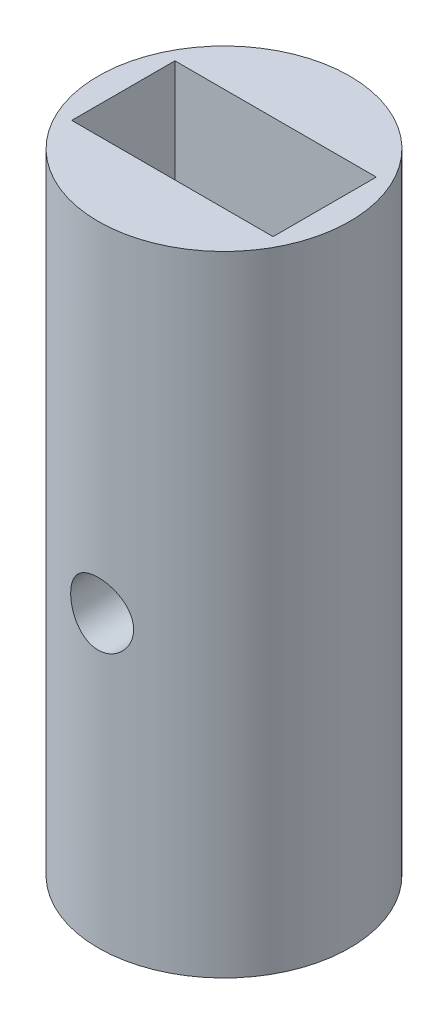
ISO-10303-21;
HEADER;
FILE_DESCRIPTION(('STEP AP214'),'2;1');
FILE_NAME('part.step','',(''),(''),'','','');
FILE_SCHEMA(('AUTOMOTIVE_DESIGN { 1 0 10303 214 1 1 1 1 }'));
ENDSEC;
DATA;
#1=APPLICATION_CONTEXT('core data for automotive mechanical design processes');
#2=APPLICATION_PROTOCOL_DEFINITION('international standard','automotive_design',2000,#1);
#3=PRODUCT_CONTEXT('',#1,'mechanical');
#4=PRODUCT('Part','Part','',(#3));
#5=PRODUCT_RELATED_PRODUCT_CATEGORY('part','',(#4));
#6=PRODUCT_DEFINITION_FORMATION('','',#4);
#7=PRODUCT_DEFINITION_CONTEXT('part definition',#1,'design');
#8=PRODUCT_DEFINITION('design','',#6,#7);
#9=PRODUCT_DEFINITION_SHAPE('','',#8);
#10=(LENGTH_UNIT() NAMED_UNIT(*) SI_UNIT(.MILLI.,.METRE.));
#11=(NAMED_UNIT(*) PLANE_ANGLE_UNIT() SI_UNIT($,.RADIAN.));
#12=(NAMED_UNIT(*) SI_UNIT($,.STERADIAN.) SOLID_ANGLE_UNIT());
#13=UNCERTAINTY_MEASURE_WITH_UNIT(LENGTH_MEASURE(1.E-05),#10,'distance_accuracy_value','');
#14=(GEOMETRIC_REPRESENTATION_CONTEXT(3) GLOBAL_UNCERTAINTY_ASSIGNED_CONTEXT((#13)) GLOBAL_UNIT_ASSIGNED_CONTEXT((#10,
#11,#12)) REPRESENTATION_CONTEXT('',''));
#15=CARTESIAN_POINT('',(0.,0.,0.));
#16=DIRECTION('',(0.,0.,1.));
#17=DIRECTION('',(1.,0.,0.));
#18=AXIS2_PLACEMENT_3D('',#15,#16,#17);
#19=CARTESIAN_POINT('',(0.,25.,0.));
#20=DIRECTION('',(0.,1.,0.));
#21=DIRECTION('',(0.,0.,1.));
#22=AXIS2_PLACEMENT_3D('',#19,#20,#21);
#23=PLANE('',#22);
#24=CARTESIAN_POINT('',(0.,25.,0.));
#25=DIRECTION('',(0.,1.,0.));
#26=DIRECTION('',(0.,0.,1.));
#27=AXIS2_PLACEMENT_3D('',#24,#25,#26);
#28=CIRCLE('',#27,5.);
#29=CARTESIAN_POINT('',(0.,25.,5.));
#30=VERTEX_POINT('',#29);
#31=EDGE_CURVE('E11',#30,#30,#28,.T.);
#32=ORIENTED_EDGE('',*,*,#31,.T.);
#33=EDGE_LOOP('',(#32));
#34=FACE_BOUND('',#33,.T.);
#35=DIRECTION('',(0.,0.,1.));
#36=VECTOR('',#35,1.);
#37=CARTESIAN_POINT('',(-4.,25.,-2.05));
#38=LINE('',#37,#36);
#39=CARTESIAN_POINT('',(-4.,25.,-2.05));
#40=VERTEX_POINT('',#39);
#41=CARTESIAN_POINT('',(-4.,25.,2.05));
#42=VERTEX_POINT('',#41);
#43=EDGE_CURVE('E92',#40,#42,#38,.T.);
#44=ORIENTED_EDGE('',*,*,#43,.F.);
#45=DIRECTION('',(-1.,0.,0.));
#46=VECTOR('',#45,1.);
#47=CARTESIAN_POINT('',(-4.,25.,-2.05));
#48=LINE('',#47,#46);
#49=CARTESIAN_POINT('',(4.,25.,-2.05));
#50=VERTEX_POINT('',#49);
#51=EDGE_CURVE('E97',#50,#40,#48,.T.);
#52=ORIENTED_EDGE('',*,*,#51,.F.);
#53=DIRECTION('',(0.,0.,1.));
#54=VECTOR('',#53,1.);
#55=CARTESIAN_POINT('',(4.,25.,-2.05));
#56=LINE('',#55,#54);
#57=CARTESIAN_POINT('',(4.,25.,2.05));
#58=VERTEX_POINT('',#57);
#59=EDGE_CURVE('E82',#50,#58,#56,.T.);
#60=ORIENTED_EDGE('',*,*,#59,.T.);
#61=DIRECTION('',(-1.,0.,0.));
#62=VECTOR('',#61,1.);
#63=CARTESIAN_POINT('',(-4.,25.,2.05));
#64=LINE('',#63,#62);
#65=EDGE_CURVE('E110',#58,#42,#64,.T.);
#66=ORIENTED_EDGE('',*,*,#65,.T.);
#67=EDGE_LOOP('',(#44,#52,#60,#66));
#68=FACE_BOUND('',#67,.T.);
#69=ADVANCED_FACE('F33',(#34,#68),#23,.T.);
#70=CARTESIAN_POINT('',(0.,25.,0.));
#71=DIRECTION('',(0.,-1.,0.));
#72=DIRECTION('',(0.,0.,-1.));
#73=AXIS2_PLACEMENT_3D('',#70,#71,#72);
#74=CYLINDRICAL_SURFACE('',#73,5.);
#75=CARTESIAN_POINT('',(0.,12.7500000000011,-5.));
#76=CARTESIAN_POINT('',(-0.0690634072247759,12.749998061886,-4.99999883223344));
#77=CARTESIAN_POINT('',(-0.138148464858969,12.7442570410229,-4.99855481776523));
#78=CARTESIAN_POINT('',(-0.274338603142109,12.7214790405786,-4.99293428191577));
#79=CARTESIAN_POINT('',(-0.341442539058947,12.7044356587195,-4.98875621183307));
#80=CARTESIAN_POINT('',(-0.471684060152144,12.6596339554493,-4.97813021943367));
#81=CARTESIAN_POINT('',(-0.534826302858331,12.6318885010717,-4.97168502368406));
#82=CARTESIAN_POINT('',(-0.655560109920348,12.566515508297,-4.95721119839661));
#83=CARTESIAN_POINT('',(-0.71315148695729,12.5288876365686,-4.94918251545042));
#84=CARTESIAN_POINT('',(-0.822334939417419,12.4439993419559,-4.93222844659835));
#85=CARTESIAN_POINT('',(-0.87379640838421,12.3965736875351,-4.92328922623778));
#86=CARTESIAN_POINT('',(-0.968124106002731,12.2937898292436,-4.90561350097942));
#87=CARTESIAN_POINT('',(-1.01098936412425,12.238430730879,-4.89687701906958));
#88=CARTESIAN_POINT('',(-1.08752211899916,12.1203373110532,-4.88045646416426));
#89=CARTESIAN_POINT('',(-1.1210435132711,12.0575056409924,-4.87278995392172));
#90=CARTESIAN_POINT('',(-1.17699742379207,11.9268763236191,-4.8595791234352));
#91=CARTESIAN_POINT('',(-1.19943171286607,11.8590794722296,-4.85403446393992));
#92=CARTESIAN_POINT('',(-1.23212903067019,11.7218804181656,-4.8458373059796));
#93=CARTESIAN_POINT('',(-1.24262689027773,11.6525375866262,-4.84312909229523));
#94=CARTESIAN_POINT('',(-1.25188481255648,11.5130261924894,-4.84074468781452));
#95=CARTESIAN_POINT('',(-1.25064678484825,11.4428577660855,-4.84106800373872));
#96=CARTESIAN_POINT('',(-1.23665543719933,11.3054868268806,-4.84466004580517));
#97=CARTESIAN_POINT('',(-1.22418195015869,11.2382536487801,-4.84785719168235));
#98=CARTESIAN_POINT('',(-1.18852015575251,11.1068657909083,-4.85672258063738));
#99=CARTESIAN_POINT('',(-1.16533108505777,11.0427113308102,-4.86239099975582));
#100=CARTESIAN_POINT('',(-1.10865789828087,10.9185516531243,-4.87562594920158));
#101=CARTESIAN_POINT('',(-1.075072222694,10.8585948568431,-4.8832110622452));
#102=CARTESIAN_POINT('',(-0.998630230012363,10.7450677418703,-4.89941425705324));
#103=CARTESIAN_POINT('',(-0.955772290673931,10.6914985432783,-4.90803251945615));
#104=CARTESIAN_POINT('',(-0.860552853900908,10.5906636535891,-4.92563233783153));
#105=CARTESIAN_POINT('',(-0.807955215138107,10.5436212582833,-4.93461724564978));
#106=CARTESIAN_POINT('',(-0.695509931252969,10.4589822979478,-4.95171637982323));
#107=CARTESIAN_POINT('',(-0.635662064756503,10.4213860214481,-4.95983057957848));
#108=CARTESIAN_POINT('',(-0.51009657390104,10.3566245114807,-4.9743144341182));
#109=CARTESIAN_POINT('',(-0.444359494340399,10.329495549789,-4.98067800106439));
#110=CARTESIAN_POINT('',(-0.309063340118946,10.2867355785764,-4.99089930826183));
#111=CARTESIAN_POINT('',(-0.239504999291947,10.2711023696526,-4.99475752782735));
#112=CARTESIAN_POINT('',(-0.100449975324899,10.2521186953687,-4.99946249392812));
#113=CARTESIAN_POINT('',(-0.0309972666567185,10.2484641449383,-5.00038377923566));
#114=CARTESIAN_POINT('',(0.107527395668045,10.252707501714,-4.99932337345375));
#115=CARTESIAN_POINT('',(0.176599383037283,10.2606043690004,-4.99734194368205));
#116=CARTESIAN_POINT('',(0.311345223980529,10.2874757569939,-4.99074650939463));
#117=CARTESIAN_POINT('',(0.377054265807413,10.3062843862319,-4.98617195154842));
#118=CARTESIAN_POINT('',(0.504381077043874,10.3542559033582,-4.97490588861777));
#119=CARTESIAN_POINT('',(0.565998432527309,10.3834198369288,-4.96821416974909));
#120=CARTESIAN_POINT('',(0.684602612024983,10.4518634407301,-4.95327756605257));
#121=CARTESIAN_POINT('',(0.741487868196634,10.4913134269984,-4.94500722805775));
#122=CARTESIAN_POINT('',(0.84793884470281,10.5789915906653,-4.92787090989514));
#123=CARTESIAN_POINT('',(0.897503299144276,10.6272212830152,-4.91900482709752));
#124=CARTESIAN_POINT('',(0.989158806727373,10.7325016340382,-4.90140797467307));
#125=CARTESIAN_POINT('',(1.03103655635179,10.7897397525032,-4.89268586822732));
#126=CARTESIAN_POINT('',(1.10459229917734,10.9106105287226,-4.8766073198103));
#127=CARTESIAN_POINT('',(1.1362707451317,10.9742429024676,-4.8692508172252));
#128=CARTESIAN_POINT('',(1.18829285050782,11.1057547686787,-4.85681745612219));
#129=CARTESIAN_POINT('',(1.20870366387846,11.1736063569545,-4.85172712743253));
#130=CARTESIAN_POINT('',(1.23778804996155,11.3119246982421,-4.84438953408484));
#131=CARTESIAN_POINT('',(1.24646418956561,11.3823908758616,-4.84214164766612));
#132=CARTESIAN_POINT('',(1.25169882527839,11.5217675198805,-4.84079084336629));
#133=CARTESIAN_POINT('',(1.24859824815015,11.5906645292718,-4.84159943940218));
#134=CARTESIAN_POINT('',(1.23114773192744,11.7269199072245,-4.84606590839868));
#135=CARTESIAN_POINT('',(1.21679801890569,11.7942783066792,-4.84972372409879));
#136=CARTESIAN_POINT('',(1.17744276620237,11.925173715889,-4.85942717235601));
#137=CARTESIAN_POINT('',(1.15250117056702,11.9887310877013,-4.86545846030257));
#138=CARTESIAN_POINT('',(1.09272076133759,12.1108044855959,-4.8792312977069));
#139=CARTESIAN_POINT('',(1.05788057502852,12.1693198109902,-4.88697308433977));
#140=CARTESIAN_POINT('',(0.978223123864302,12.2812955241695,-4.90354695219593));
#141=CARTESIAN_POINT('',(0.933169302426898,12.3345842278544,-4.91240220693131));
#142=CARTESIAN_POINT('',(0.834824475991461,12.432955870664,-4.93006689371905));
#143=CARTESIAN_POINT('',(0.781531517717634,12.4780368584286,-4.93887631439216));
#144=CARTESIAN_POINT('',(0.667056322252166,12.559509423805,-4.95564713039719));
#145=CARTESIAN_POINT('',(0.605748685263662,12.5957288447274,-4.9635902780489));
#146=CARTESIAN_POINT('',(0.477721716258732,12.6572895524516,-4.97754104145932));
#147=CARTESIAN_POINT('',(0.41100630286395,12.6826386338749,-4.98355004333151));
#148=CARTESIAN_POINT('',(0.287008544369559,12.7179765252758,-4.99206716304618));
#149=CARTESIAN_POINT('',(0.230316809090056,12.7299593692123,-4.99502154210576));
#150=CARTESIAN_POINT('',(0.115755059613569,12.745971619686,-4.9989883769329));
#151=CARTESIAN_POINT('',(0.0578851343688464,12.7500016244222,-5.00000097875745));
#152=CARTESIAN_POINT('',(0.,12.7500000000011,-5.));
#153=B_SPLINE_CURVE_WITH_KNOTS('',3,(#75,#76,#77,#78,#79,#80,#81,#82,#83,#84,#85,#86,#87,#88,
#89,#90,#91,#92,#93,#94,#95,#96,#97,#98,#99,#100,#101,#102,#103,#104,#105,#106,#107,#108,#109,
#110,#111,#112,#113,#114,#115,#116,#117,#118,#119,#120,#121,#122,#123,#124,#125,#126,#127,#128,
#129,#130,#131,#132,#133,#134,#135,#136,#137,#138,#139,#140,#141,#142,#143,#144,#145,#146,#147,
#148,#149,#150,#151,#152),.UNSPECIFIED.,.T.,.F.,(4,2,2,2,2,2,2,2,2,2,2,2,2,2,2,2,2,2,2,2,2,2,2,
2,2,2,2,2,2,2,2,2,2,2,2,2,2,2,4),(0.,0.206978093726575,0.414073531469916,0.620920751905089,
0.827774950141107,1.03845362864283,1.24915607983385,1.46298872954839,1.6767871764114,
1.88630245916192,2.09578365093914,2.30018747505848,2.50460586221698,2.71108773228233,
2.91760575696802,3.13001250807516,3.34242574631873,3.55556857507595,3.76867061407202,
3.97631924124396,4.18394917593952,4.38850228761697,4.59307606101908,4.80127989637793,
5.00951969173349,5.2228709100373,5.4362126562459,5.6482687884503,5.8602785271034,
6.06619816998843,6.27211367463361,6.47680333799539,6.68152140114084,6.89157980341591,
7.10168808142014,7.3156015458299,7.52936136517791,7.7028520245179,7.87632963369199),.UNSPECIFIED.);
#154=CARTESIAN_POINT('',(0.,12.7500000000011,-5.));
#155=VERTEX_POINT('',#154);
#156=EDGE_CURVE('E108',#155,#155,#153,.T.);
#157=ORIENTED_EDGE('',*,*,#156,.T.);
#158=EDGE_LOOP('',(#157));
#159=FACE_BOUND('',#158,.T.);
#160=CARTESIAN_POINT('',(1.25000000000006,11.5000000000011,4.84122918275926));
#161=CARTESIAN_POINT('',(1.24999803929595,11.4309746245388,4.84123050042653));
#162=CARTESIAN_POINT('',(1.24426312274871,11.3619275506621,4.84272153006955));
#163=CARTESIAN_POINT('',(1.22151156273213,11.2258162109141,4.84850930996623));
#164=CARTESIAN_POINT('',(1.20448835337116,11.1587531227669,4.85280769310905));
#165=CARTESIAN_POINT('',(1.15974559981603,11.0285982309076,4.86369362297982));
#166=CARTESIAN_POINT('',(1.13203986392729,10.9655014223083,4.87027821345203));
#167=CARTESIAN_POINT('',(1.06676057063076,10.8448445737311,4.88499096014403));
#168=CARTESIAN_POINT('',(1.0291865942804,10.787284768961,4.8931191818925));
#169=CARTESIAN_POINT('',(0.944354213655997,10.67806917737,4.91020358177805));
#170=CARTESIAN_POINT('',(0.896918443852084,10.6265531998261,4.91917298811514));
#171=CARTESIAN_POINT('',(0.794091032050392,10.5321193028209,4.93681437757648));
#172=CARTESIAN_POINT('',(0.738698647090214,10.4892021871902,4.94548633283194));
#173=CARTESIAN_POINT('',(0.620572600539538,10.4126122661855,4.9617020776029));
#174=CARTESIAN_POINT('',(0.557747288097621,10.3790768059204,4.96922843700295));
#175=CARTESIAN_POINT('',(0.427131592146442,10.3230951779246,4.98215405962991));
#176=CARTESIAN_POINT('',(0.35934194289603,10.3006473740433,4.98755363667172));
#177=CARTESIAN_POINT('',(0.222179379377141,10.2679260827118,4.9955237942409));
#178=CARTESIAN_POINT('',(0.152866359774548,10.2574151778378,4.99814946922157));
#179=CARTESIAN_POINT('',(0.013414409631444,10.2481208103633,5.00046797053649));
#180=CARTESIAN_POINT('',(-0.0567243972689752,10.2493356138963,5.00016123048352));
#181=CARTESIAN_POINT('',(-0.194190308965426,10.2632874251262,4.99669047476768));
#182=CARTESIAN_POINT('',(-0.261545269501275,10.275768162528,4.99359001170437));
#183=CARTESIAN_POINT('',(-0.393172809267049,10.3114856350253,4.98495418262427));
#184=CARTESIAN_POINT('',(-0.457445224212989,10.3347229426898,4.97941868699221));
#185=CARTESIAN_POINT('',(-0.5817583793772,10.3915012853446,4.96643754850448));
#186=CARTESIAN_POINT('',(-0.641755637208072,10.425133522332,4.95897509847527));
#187=CARTESIAN_POINT('',(-0.755344527925552,10.5016778395592,4.94294951904825));
#188=CARTESIAN_POINT('',(-0.808935043856823,10.5445915342814,4.93438619826246));
#189=CARTESIAN_POINT('',(-0.909717543856135,10.6398543709923,4.91681856884761));
#190=CARTESIAN_POINT('',(-0.956697098843938,10.692427446175,4.9078085976296));
#191=CARTESIAN_POINT('',(-1.04122046995371,10.8047999867712,4.89057521758355));
#192=CARTESIAN_POINT('',(-1.07876384505746,10.8645997897466,4.88235184552987));
#193=CARTESIAN_POINT('',(-1.14348516127819,10.9901450170756,4.86760248415826));
#194=CARTESIAN_POINT('',(-1.17061195871305,11.0559178651577,4.86108491862862));
#195=CARTESIAN_POINT('',(-1.21335702579536,11.1912927340393,4.8505932006998));
#196=CARTESIAN_POINT('',(-1.22897775819108,11.2608939319927,4.84661850405111));
#197=CARTESIAN_POINT('',(-1.24791481933253,11.3999797507627,4.84177678019572));
#198=CARTESIAN_POINT('',(-1.25154523695975,11.4694188966659,4.84083044546826));
#199=CARTESIAN_POINT('',(-1.24725849525771,11.6079109682902,4.84193671740521));
#200=CARTESIAN_POINT('',(-1.23934239892434,11.6769639289767,4.84398904800635));
#201=CARTESIAN_POINT('',(-1.21246273196877,11.8115571324784,4.85078540977282));
#202=CARTESIAN_POINT('',(-1.19368203414081,11.8771363632865,4.85548485117189));
#203=CARTESIAN_POINT('',(-1.14580904083525,12.0042157289269,4.86700359135483));
#204=CARTESIAN_POINT('',(-1.11671552385621,12.0657153795288,4.87382314124308));
#205=CARTESIAN_POINT('',(-1.04838533396822,12.1842206389348,4.88898068546633));
#206=CARTESIAN_POINT('',(-1.00896087691775,12.2411144200226,4.89734584303322));
#207=CARTESIAN_POINT('',(-0.921325366168008,12.3475941814018,4.91458541535859));
#208=CARTESIAN_POINT('',(-0.873112868506737,12.3971789583261,4.92345991364236));
#209=CARTESIAN_POINT('',(-0.767828401230844,12.4889055212866,4.94098701515804));
#210=CARTESIAN_POINT('',(-0.710564940664427,12.5308300312755,4.94962851030919));
#211=CARTESIAN_POINT('',(-0.58962835336828,12.6044679334767,4.96548608306868));
#212=CARTESIAN_POINT('',(-0.525955561196924,12.6361818583052,4.97270223501981));
#213=CARTESIAN_POINT('',(-0.394447752163798,12.6882230172651,4.98485057869157));
#214=CARTESIAN_POINT('',(-0.326646726284787,12.7086321421906,4.98979915011205));
#215=CARTESIAN_POINT('',(-0.188437200398446,12.7377301673053,4.99692646697894));
#216=CARTESIAN_POINT('',(-0.118029206301491,12.7464213293706,4.99910574696704));
#217=CARTESIAN_POINT('',(0.0213544080542203,12.7517094869705,5.00042711761014));
#218=CARTESIAN_POINT('',(0.0903172837076036,12.7486271363703,4.9996497360001));
#219=CARTESIAN_POINT('',(0.226709370518486,12.7311902158832,4.99532370571779));
#220=CARTESIAN_POINT('',(0.29413862722617,12.7168359812347,4.99177513946368));
#221=CARTESIAN_POINT('',(0.425213794556082,12.6774347252874,4.98231791067453));
#222=CARTESIAN_POINT('',(0.488878118226335,12.6524456833578,4.97642205628332));
#223=CARTESIAN_POINT('',(0.611146316301897,12.5925367762269,4.96289111141729));
#224=CARTESIAN_POINT('',(0.669749551581375,12.5576156591641,4.95525580172169));
#225=CARTESIAN_POINT('',(0.781752410529935,12.4778559575047,4.93884062101665));
#226=CARTESIAN_POINT('',(0.834993735375791,12.4327998213669,4.93003771182013));
#227=CARTESIAN_POINT('',(0.93326877533913,12.3344714350338,4.91238311316551));
#228=CARTESIAN_POINT('',(0.978300406335297,12.2811971048787,4.90353141190694));
#229=CARTESIAN_POINT('',(1.0597025330991,12.1667482322494,4.88659344825684));
#230=CARTESIAN_POINT('',(1.09589577430825,12.1054448457353,4.87852454662354));
#231=CARTESIAN_POINT('',(1.15740862076964,11.9774306375977,4.86429944438268));
#232=CARTESIAN_POINT('',(1.18273613719971,11.9107237923677,4.85814185308377));
#233=CARTESIAN_POINT('',(1.21802816070686,11.7867787352177,4.84939885924728));
#234=CARTESIAN_POINT('',(1.22999146324428,11.7301335445213,4.84635828750682));
#235=CARTESIAN_POINT('',(1.24597786571664,11.6156639137511,4.84227298231964));
#236=CARTESIAN_POINT('',(1.25000164296529,11.5578395746948,4.84122807862452));
#237=CARTESIAN_POINT('',(1.25000000000006,11.5000000000011,4.84122918275926));
#238=B_SPLINE_CURVE_WITH_KNOTS('',3,(#160,#161,#162,#163,#164,#165,#166,#167,#168,#169,#170,
#171,#172,#173,#174,#175,#176,#177,#178,#179,#180,#181,#182,#183,#184,#185,#186,#187,#188,#189,
#190,#191,#192,#193,#194,#195,#196,#197,#198,#199,#200,#201,#202,#203,#204,#205,#206,#207,#208,
#209,#210,#211,#212,#213,#214,#215,#216,#217,#218,#219,#220,#221,#222,#223,#224,#225,#226,#227,
#228,#229,#230,#231,#232,#233,#234,#235,#236,#237),.UNSPECIFIED.,.T.,.F.,(4,2,2,2,2,2,2,2,2,2,2,
2,2,2,2,2,2,2,2,2,2,2,2,2,2,2,2,2,2,2,2,2,2,2,2,2,2,2,4),(0.,0.206863720868071,
0.413847870714333,0.620565363583013,0.827291633777391,1.03811977096488,1.24896760739933,
1.4627574819896,1.67651579923546,1.88594375497673,2.0953407433301,2.30009131344474,
2.50485278362393,2.71146437127222,2.91811192734457,3.13035233285955,3.34260265599901,
3.55588216004201,3.76911600064773,3.97671787380858,4.18430063591901,4.38848702504603,
4.59269760710709,4.80091422929578,5.00916509442522,5.22262665482659,5.43607707859777,
5.64796036403464,5.85980274454519,6.06591723063728,6.2720255868849,6.47702438279855,
6.68204902869036,6.89198548291035,7.10197515782754,7.31588238642338,7.52963360683309,
7.70298913588664,7.8763298754976),.UNSPECIFIED.);
#239=CARTESIAN_POINT('',(1.25000000000006,11.5000000000011,4.84122918275926));
#240=VERTEX_POINT('',#239);
#241=EDGE_CURVE('E154',#240,#240,#238,.T.);
#242=ORIENTED_EDGE('',*,*,#241,.T.);
#243=EDGE_LOOP('',(#242));
#244=FACE_BOUND('',#243,.T.);
#245=ORIENTED_EDGE('',*,*,#31,.F.);
#246=EDGE_LOOP('',(#245));
#247=FACE_BOUND('',#246,.T.);
#248=CARTESIAN_POINT('',(0.,0.,0.));
#249=DIRECTION('',(0.,1.,0.));
#250=DIRECTION('',(0.,0.,1.));
#251=AXIS2_PLACEMENT_3D('',#248,#249,#250);
#252=CIRCLE('',#251,5.);
#253=CARTESIAN_POINT('',(0.,0.,5.));
#254=VERTEX_POINT('',#253);
#255=EDGE_CURVE('E43',#254,#254,#252,.T.);
#256=ORIENTED_EDGE('',*,*,#255,.T.);
#257=EDGE_LOOP('',(#256));
#258=FACE_BOUND('',#257,.T.);
#259=ADVANCED_FACE('F35',(#159,#244,#247,#258),#74,.T.);
#260=CARTESIAN_POINT('',(0.,0.,0.));
#261=DIRECTION('',(0.,1.,0.));
#262=DIRECTION('',(0.,0.,1.));
#263=AXIS2_PLACEMENT_3D('',#260,#261,#262);
#264=PLANE('',#263);
#265=ORIENTED_EDGE('',*,*,#255,.F.);
#266=EDGE_LOOP('',(#265));
#267=FACE_BOUND('',#266,.T.);
#268=ADVANCED_FACE('F119',(#267),#264,.F.);
#269=CARTESIAN_POINT('',(0.,11.5,-2.05));
#270=DIRECTION('',(0.,0.,1.));
#271=DIRECTION('',(1.,0.,0.));
#272=AXIS2_PLACEMENT_3D('',#269,#270,#271);
#273=CYLINDRICAL_SURFACE('',#272,4.);
#274=CARTESIAN_POINT('',(0.,11.5,2.05));
#275=DIRECTION('',(0.,0.,1.));
#276=DIRECTION('',(1.,0.,0.));
#277=AXIS2_PLACEMENT_3D('',#274,#275,#276);
#278=CIRCLE('',#277,4.);
#279=CARTESIAN_POINT('',(-4.,11.5,2.05));
#280=VERTEX_POINT('',#279);
#281=CARTESIAN_POINT('',(4.,11.5,2.05));
#282=VERTEX_POINT('',#281);
#283=EDGE_CURVE('E106',#280,#282,#278,.T.);
#284=ORIENTED_EDGE('',*,*,#283,.T.);
#285=DIRECTION('',(0.,0.,1.));
#286=VECTOR('',#285,1.);
#287=CARTESIAN_POINT('',(4.,11.5,-2.05));
#288=LINE('',#287,#286);
#289=CARTESIAN_POINT('',(4.,11.5,-2.05));
#290=VERTEX_POINT('',#289);
#291=EDGE_CURVE('E76',#290,#282,#288,.T.);
#292=ORIENTED_EDGE('',*,*,#291,.F.);
#293=CARTESIAN_POINT('',(0.,11.5,-2.05));
#294=DIRECTION('',(0.,0.,1.));
#295=DIRECTION('',(1.,0.,0.));
#296=AXIS2_PLACEMENT_3D('',#293,#294,#295);
#297=CIRCLE('',#296,4.);
#298=CARTESIAN_POINT('',(-4.,11.5,-2.05));
#299=VERTEX_POINT('',#298);
#300=EDGE_CURVE('E98',#299,#290,#297,.T.);
#301=ORIENTED_EDGE('',*,*,#300,.F.);
#302=DIRECTION('',(0.,0.,1.));
#303=VECTOR('',#302,1.);
#304=CARTESIAN_POINT('',(-4.,11.5,-2.05));
#305=LINE('',#304,#303);
#306=EDGE_CURVE('E59',#299,#280,#305,.T.);
#307=ORIENTED_EDGE('',*,*,#306,.T.);
#308=EDGE_LOOP('',(#284,#292,#301,#307));
#309=FACE_BOUND('',#308,.T.);
#310=ADVANCED_FACE('F121',(#309),#273,.F.);
#311=CARTESIAN_POINT('',(-4.,11.5,-2.05));
#312=DIRECTION('',(-1.,0.,0.));
#313=DIRECTION('',(0.,0.,1.));
#314=AXIS2_PLACEMENT_3D('',#311,#312,#313);
#315=PLANE('',#314);
#316=DIRECTION('',(0.,-1.,0.));
#317=VECTOR('',#316,1.);
#318=CARTESIAN_POINT('',(-4.,11.5,2.05));
#319=LINE('',#318,#317);
#320=EDGE_CURVE('E51',#42,#280,#319,.T.);
#321=ORIENTED_EDGE('',*,*,#320,.T.);
#322=ORIENTED_EDGE('',*,*,#306,.F.);
#323=DIRECTION('',(0.,-1.,0.));
#324=VECTOR('',#323,1.);
#325=CARTESIAN_POINT('',(-4.,11.5,-2.05));
#326=LINE('',#325,#324);
#327=EDGE_CURVE('E101',#40,#299,#326,.T.);
#328=ORIENTED_EDGE('',*,*,#327,.F.);
#329=ORIENTED_EDGE('',*,*,#43,.T.);
#330=EDGE_LOOP('',(#321,#322,#328,#329));
#331=FACE_BOUND('',#330,.T.);
#332=ADVANCED_FACE('F126',(#331),#315,.F.);
#333=CARTESIAN_POINT('',(4.,11.5,-2.05));
#334=DIRECTION('',(1.,0.,0.));
#335=DIRECTION('',(0.,0.,-1.));
#336=AXIS2_PLACEMENT_3D('',#333,#334,#335);
#337=PLANE('',#336);
#338=DIRECTION('',(0.,1.,0.));
#339=VECTOR('',#338,1.);
#340=CARTESIAN_POINT('',(4.,11.5,2.05));
#341=LINE('',#340,#339);
#342=EDGE_CURVE('E88',#282,#58,#341,.T.);
#343=ORIENTED_EDGE('',*,*,#342,.T.);
#344=ORIENTED_EDGE('',*,*,#59,.F.);
#345=DIRECTION('',(0.,1.,0.));
#346=VECTOR('',#345,1.);
#347=CARTESIAN_POINT('',(4.,11.5,-2.05));
#348=LINE('',#347,#346);
#349=EDGE_CURVE('E85',#290,#50,#348,.T.);
#350=ORIENTED_EDGE('',*,*,#349,.F.);
#351=ORIENTED_EDGE('',*,*,#291,.T.);
#352=EDGE_LOOP('',(#343,#344,#350,#351));
#353=FACE_BOUND('',#352,.T.);
#354=ADVANCED_FACE('F84',(#353),#337,.F.);
#355=CARTESIAN_POINT('',(0.,11.5,-2.05));
#356=DIRECTION('',(0.,0.,1.));
#357=DIRECTION('',(1.,0.,0.));
#358=AXIS2_PLACEMENT_3D('',#355,#356,#357);
#359=PLANE('',#358);
#360=CARTESIAN_POINT('',(0.,11.5000000000011,-2.05));
#361=DIRECTION('',(0.,0.,1.));
#362=DIRECTION('',(1.,0.,0.));
#363=AXIS2_PLACEMENT_3D('',#360,#361,#362);
#364=CIRCLE('',#363,1.25);
#365=CARTESIAN_POINT('',(1.25000000000006,11.5000000000011,-2.05));
#366=VERTEX_POINT('',#365);
#367=EDGE_CURVE('E166',#366,#366,#364,.T.);
#368=ORIENTED_EDGE('',*,*,#367,.F.);
#369=EDGE_LOOP('',(#368));
#370=FACE_BOUND('',#369,.T.);
#371=ORIENTED_EDGE('',*,*,#300,.T.);
#372=ORIENTED_EDGE('',*,*,#349,.T.);
#373=ORIENTED_EDGE('',*,*,#51,.T.);
#374=ORIENTED_EDGE('',*,*,#327,.T.);
#375=EDGE_LOOP('',(#371,#372,#373,#374));
#376=FACE_BOUND('',#375,.T.);
#377=ADVANCED_FACE('F95',(#370,#376),#359,.T.);
#378=CARTESIAN_POINT('',(0.,11.5,2.05));
#379=DIRECTION('',(0.,0.,1.));
#380=DIRECTION('',(1.,0.,0.));
#381=AXIS2_PLACEMENT_3D('',#378,#379,#380);
#382=PLANE('',#381);
#383=CARTESIAN_POINT('',(0.,11.5000000000011,2.05));
#384=DIRECTION('',(0.,0.,1.));
#385=DIRECTION('',(1.,0.,0.));
#386=AXIS2_PLACEMENT_3D('',#383,#384,#385);
#387=CIRCLE('',#386,1.25);
#388=CARTESIAN_POINT('',(1.25000000000006,11.5000000000011,2.05));
#389=VERTEX_POINT('',#388);
#390=EDGE_CURVE('E38',#389,#389,#387,.T.);
#391=ORIENTED_EDGE('',*,*,#390,.T.);
#392=EDGE_LOOP('',(#391));
#393=FACE_BOUND('',#392,.T.);
#394=ORIENTED_EDGE('',*,*,#283,.F.);
#395=ORIENTED_EDGE('',*,*,#320,.F.);
#396=ORIENTED_EDGE('',*,*,#65,.F.);
#397=ORIENTED_EDGE('',*,*,#342,.F.);
#398=EDGE_LOOP('',(#394,#395,#396,#397));
#399=FACE_BOUND('',#398,.T.);
#400=ADVANCED_FACE('F140',(#393,#399),#382,.F.);
#401=CARTESIAN_POINT('',(0.,11.5000000000011,-5.));
#402=DIRECTION('',(0.,0.,1.));
#403=DIRECTION('',(1.,0.,0.));
#404=AXIS2_PLACEMENT_3D('',#401,#402,#403);
#405=CYLINDRICAL_SURFACE('',#404,1.25);
#406=ORIENTED_EDGE('',*,*,#390,.F.);
#407=EDGE_LOOP('',(#406));
#408=FACE_BOUND('',#407,.T.);
#409=ORIENTED_EDGE('',*,*,#241,.F.);
#410=EDGE_LOOP('',(#409));
#411=FACE_BOUND('',#410,.T.);
#412=ADVANCED_FACE('F143',(#408,#411),#405,.F.);
#413=ORIENTED_EDGE('',*,*,#367,.T.);
#414=EDGE_LOOP('',(#413));
#415=FACE_BOUND('',#414,.T.);
#416=ORIENTED_EDGE('',*,*,#156,.F.);
#417=EDGE_LOOP('',(#416));
#418=FACE_BOUND('',#417,.T.);
#419=ADVANCED_FACE('F148',(#415,#418),#405,.F.);
#420=CLOSED_SHELL('',(#69,#259,#268,#310,#332,#354,#377,#400,#412,#419));
#421=MANIFOLD_SOLID_BREP('B2',#420);
#422=ADVANCED_BREP_SHAPE_REPRESENTATION('',(#18,#421),#14);
#423=SHAPE_DEFINITION_REPRESENTATION(#9,#422);
ENDSEC;
END-ISO-10303-21;
